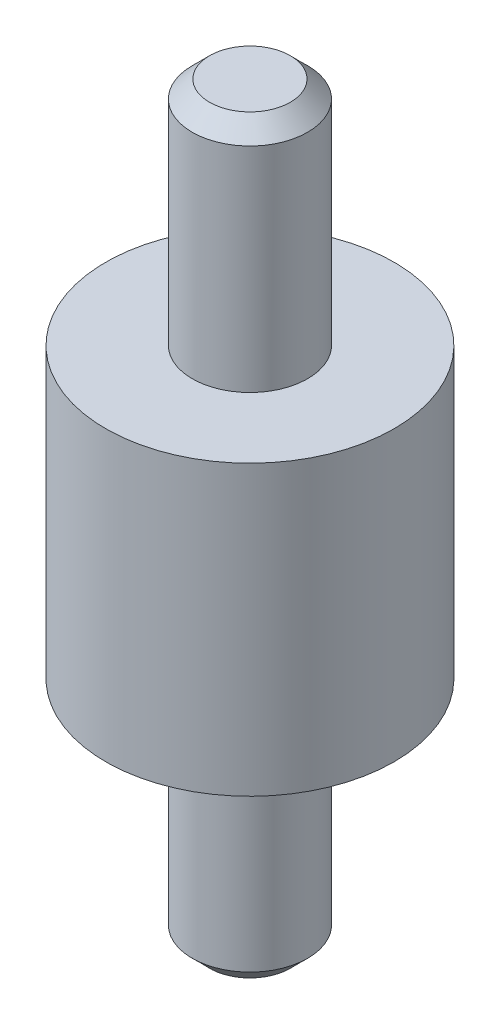
ISO-10303-21;
HEADER;
FILE_DESCRIPTION(('STEP AP214'),'2;1');
FILE_NAME('part.step','',(''),(''),'','','');
FILE_SCHEMA(('AUTOMOTIVE_DESIGN { 1 0 10303 214 1 1 1 1 }'));
ENDSEC;
DATA;
#1=APPLICATION_CONTEXT('core data for automotive mechanical design processes');
#2=APPLICATION_PROTOCOL_DEFINITION('international standard','automotive_design',2000,#1);
#3=PRODUCT_CONTEXT('',#1,'mechanical');
#4=PRODUCT('Part','Part','',(#3));
#5=PRODUCT_RELATED_PRODUCT_CATEGORY('part','',(#4));
#6=PRODUCT_DEFINITION_FORMATION('','',#4);
#7=PRODUCT_DEFINITION_CONTEXT('part definition',#1,'design');
#8=PRODUCT_DEFINITION('design','',#6,#7);
#9=PRODUCT_DEFINITION_SHAPE('','',#8);
#10=(LENGTH_UNIT() NAMED_UNIT(*) SI_UNIT(.MILLI.,.METRE.));
#11=(NAMED_UNIT(*) PLANE_ANGLE_UNIT() SI_UNIT($,.RADIAN.));
#12=(NAMED_UNIT(*) SI_UNIT($,.STERADIAN.) SOLID_ANGLE_UNIT());
#13=UNCERTAINTY_MEASURE_WITH_UNIT(LENGTH_MEASURE(1.E-05),#10,'distance_accuracy_value','');
#14=(GEOMETRIC_REPRESENTATION_CONTEXT(3) GLOBAL_UNCERTAINTY_ASSIGNED_CONTEXT((#13)) GLOBAL_UNIT_ASSIGNED_CONTEXT((#10,
#11,#12)) REPRESENTATION_CONTEXT('',''));
#15=CARTESIAN_POINT('',(0.,0.,0.));
#16=DIRECTION('',(0.,0.,1.));
#17=DIRECTION('',(1.,0.,0.));
#18=AXIS2_PLACEMENT_3D('',#15,#16,#17);
#19=CARTESIAN_POINT('',(0.,20.6375,0.));
#20=DIRECTION('',(0.,1.,0.));
#21=DIRECTION('',(0.,0.,1.));
#22=AXIS2_PLACEMENT_3D('',#19,#20,#21);
#23=PLANE('',#22);
#24=CARTESIAN_POINT('',(0.,20.6375,0.));
#25=DIRECTION('',(0.,1.,0.));
#26=DIRECTION('',(0.,0.,1.));
#27=AXIS2_PLACEMENT_3D('',#24,#25,#26);
#28=CIRCLE('',#27,2.2225);
#29=CARTESIAN_POINT('',(0.,20.6375,2.2225));
#30=VERTEX_POINT('',#29);
#31=EDGE_CURVE('E47',#30,#30,#28,.T.);
#32=ORIENTED_EDGE('',*,*,#31,.T.);
#33=EDGE_LOOP('',(#32));
#34=FACE_BOUND('',#33,.T.);
#35=ADVANCED_FACE('F39',(#34),#23,.T.);
#36=CARTESIAN_POINT('',(0.,7.9375,0.));
#37=DIRECTION('',(0.,-1.,0.));
#38=DIRECTION('',(0.,0.,-1.));
#39=AXIS2_PLACEMENT_3D('',#36,#37,#38);
#40=CYLINDRICAL_SURFACE('',#39,3.175);
#41=CARTESIAN_POINT('',(0.,19.685,0.));
#42=DIRECTION('',(0.,1.,0.));
#43=DIRECTION('',(0.,0.,1.));
#44=AXIS2_PLACEMENT_3D('',#41,#42,#43);
#45=CIRCLE('',#44,3.175);
#46=CARTESIAN_POINT('',(0.,19.685,3.175));
#47=VERTEX_POINT('',#46);
#48=EDGE_CURVE('E52',#47,#47,#45,.F.);
#49=ORIENTED_EDGE('',*,*,#48,.T.);
#50=EDGE_LOOP('',(#49));
#51=FACE_BOUND('',#50,.T.);
#52=CARTESIAN_POINT('',(0.,7.9375,0.));
#53=DIRECTION('',(0.,-1.,0.));
#54=DIRECTION('',(0.,0.,-1.));
#55=AXIS2_PLACEMENT_3D('',#52,#53,#54);
#56=CIRCLE('',#55,3.175);
#57=CARTESIAN_POINT('',(0.,7.9375,-3.175));
#58=VERTEX_POINT('',#57);
#59=EDGE_CURVE('E57',#58,#58,#56,.T.);
#60=ORIENTED_EDGE('',*,*,#59,.F.);
#61=EDGE_LOOP('',(#60));
#62=FACE_BOUND('',#61,.T.);
#63=ADVANCED_FACE('F95',(#51,#62),#40,.T.);
#64=CARTESIAN_POINT('',(0.,19.685,0.));
#65=DIRECTION('',(0.,-1.,0.));
#66=DIRECTION('',(0.,0.,-1.));
#67=AXIS2_PLACEMENT_3D('',#64,#65,#66);
#68=CONICAL_SURFACE('',#67,3.175,0.785398163397451);
#69=ORIENTED_EDGE('',*,*,#31,.F.);
#70=EDGE_LOOP('',(#69));
#71=FACE_BOUND('',#70,.T.);
#72=ORIENTED_EDGE('',*,*,#48,.F.);
#73=EDGE_LOOP('',(#72));
#74=FACE_BOUND('',#73,.T.);
#75=ADVANCED_FACE('F41',(#71,#74),#68,.T.);
#76=CARTESIAN_POINT('',(-7.9375,-7.9375,0.));
#77=DIRECTION('',(0.,-1.,0.));
#78=DIRECTION('',(1.,0.,0.));
#79=AXIS2_PLACEMENT_3D('',#76,#77,#78);
#80=PLANE('',#79);
#81=CARTESIAN_POINT('',(0.,-7.9375,0.));
#82=DIRECTION('',(0.,-1.,0.));
#83=DIRECTION('',(1.,0.,0.));
#84=AXIS2_PLACEMENT_3D('',#81,#82,#83);
#85=CIRCLE('',#84,3.175);
#86=CARTESIAN_POINT('',(3.175,-7.9375,0.));
#87=VERTEX_POINT('',#86);
#88=EDGE_CURVE('E10',#87,#87,#85,.T.);
#89=ORIENTED_EDGE('',*,*,#88,.F.);
#90=EDGE_LOOP('',(#89));
#91=FACE_BOUND('',#90,.T.);
#92=CARTESIAN_POINT('',(0.,-7.9375,0.));
#93=DIRECTION('',(0.,-1.,0.));
#94=DIRECTION('',(1.,0.,0.));
#95=AXIS2_PLACEMENT_3D('',#92,#93,#94);
#96=CIRCLE('',#95,7.9375);
#97=CARTESIAN_POINT('',(7.9375,-7.9375,0.));
#98=VERTEX_POINT('',#97);
#99=EDGE_CURVE('E67',#98,#98,#96,.T.);
#100=ORIENTED_EDGE('',*,*,#99,.T.);
#101=EDGE_LOOP('',(#100));
#102=FACE_BOUND('',#101,.T.);
#103=ADVANCED_FACE('F102',(#91,#102),#80,.T.);
#104=CARTESIAN_POINT('',(0.,7.9375,0.));
#105=DIRECTION('',(0.,1.,0.));
#106=DIRECTION('',(-1.,0.,0.));
#107=AXIS2_PLACEMENT_3D('',#104,#105,#106);
#108=PLANE('',#107);
#109=ORIENTED_EDGE('',*,*,#59,.T.);
#110=EDGE_LOOP('',(#109));
#111=FACE_BOUND('',#110,.T.);
#112=CARTESIAN_POINT('',(0.,7.9375,0.));
#113=DIRECTION('',(0.,-1.,0.));
#114=DIRECTION('',(1.,0.,0.));
#115=AXIS2_PLACEMENT_3D('',#112,#113,#114);
#116=CIRCLE('',#115,7.93750000000001);
#117=CARTESIAN_POINT('',(7.93750000000001,7.9375,0.));
#118=VERTEX_POINT('',#117);
#119=EDGE_CURVE('E63',#118,#118,#116,.T.);
#120=ORIENTED_EDGE('',*,*,#119,.F.);
#121=EDGE_LOOP('',(#120));
#122=FACE_BOUND('',#121,.T.);
#123=ADVANCED_FACE('F105',(#111,#122),#108,.T.);
#124=CARTESIAN_POINT('',(0.,-7.9375,0.));
#125=DIRECTION('',(0.,-1.,0.));
#126=DIRECTION('',(1.,0.,0.));
#127=AXIS2_PLACEMENT_3D('',#124,#125,#126);
#128=CYLINDRICAL_SURFACE('',#127,7.9375);
#129=ORIENTED_EDGE('',*,*,#119,.T.);
#130=EDGE_LOOP('',(#129));
#131=FACE_BOUND('',#130,.T.);
#132=ORIENTED_EDGE('',*,*,#99,.F.);
#133=EDGE_LOOP('',(#132));
#134=FACE_BOUND('',#133,.T.);
#135=ADVANCED_FACE('F108',(#131,#134),#128,.T.);
#136=CARTESIAN_POINT('',(0.,-20.6375,-1.4411089226075E-13));
#137=DIRECTION('',(0.,-1.,0.));
#138=DIRECTION('',(0.,0.,-1.));
#139=AXIS2_PLACEMENT_3D('',#136,#137,#138);
#140=PLANE('',#139);
#141=CARTESIAN_POINT('',(0.,-20.6375,-1.4411089226075E-13));
#142=DIRECTION('',(0.,-1.,0.));
#143=DIRECTION('',(0.,0.,-1.));
#144=AXIS2_PLACEMENT_3D('',#141,#142,#143);
#145=CIRCLE('',#144,2.2225);
#146=CARTESIAN_POINT('',(0.,-20.6375,-2.22250000000014));
#147=VERTEX_POINT('',#146);
#148=EDGE_CURVE('E71',#147,#147,#145,.T.);
#149=ORIENTED_EDGE('',*,*,#148,.T.);
#150=EDGE_LOOP('',(#149));
#151=FACE_BOUND('',#150,.T.);
#152=ADVANCED_FACE('F89',(#151),#140,.T.);
#153=CARTESIAN_POINT('',(0.,-7.9375,0.));
#154=DIRECTION('',(0.,1.,0.));
#155=DIRECTION('',(0.,0.,1.));
#156=AXIS2_PLACEMENT_3D('',#153,#154,#155);
#157=CYLINDRICAL_SURFACE('',#156,3.175);
#158=CARTESIAN_POINT('',(0.,-19.685,-1.37459620310254E-13));
#159=DIRECTION('',(0.,-1.,0.));
#160=DIRECTION('',(0.,0.,-1.));
#161=AXIS2_PLACEMENT_3D('',#158,#159,#160);
#162=CIRCLE('',#161,3.175);
#163=CARTESIAN_POINT('',(0.,-19.685,-3.17500000000014));
#164=VERTEX_POINT('',#163);
#165=EDGE_CURVE('E75',#164,#164,#162,.F.);
#166=ORIENTED_EDGE('',*,*,#165,.T.);
#167=EDGE_LOOP('',(#166));
#168=FACE_BOUND('',#167,.T.);
#169=ORIENTED_EDGE('',*,*,#88,.T.);
#170=EDGE_LOOP('',(#169));
#171=FACE_BOUND('',#170,.T.);
#172=ADVANCED_FACE('F80',(#168,#171),#157,.T.);
#173=CARTESIAN_POINT('',(0.,-19.685,-1.37459620310254E-13));
#174=DIRECTION('',(0.,1.,0.));
#175=DIRECTION('',(0.,0.,1.));
#176=AXIS2_PLACEMENT_3D('',#173,#174,#175);
#177=CONICAL_SURFACE('',#176,3.175,0.785398163397451);
#178=ORIENTED_EDGE('',*,*,#148,.F.);
#179=EDGE_LOOP('',(#178));
#180=FACE_BOUND('',#179,.T.);
#181=ORIENTED_EDGE('',*,*,#165,.F.);
#182=EDGE_LOOP('',(#181));
#183=FACE_BOUND('',#182,.T.);
#184=ADVANCED_FACE('F82',(#180,#183),#177,.T.);
#185=CLOSED_SHELL('',(#35,#63,#75,#103,#123,#135,#152,#172,#184));
#186=MANIFOLD_SOLID_BREP('B2',#185);
#187=ADVANCED_BREP_SHAPE_REPRESENTATION('',(#18,#186),#14);
#188=SHAPE_DEFINITION_REPRESENTATION(#9,#187);
ENDSEC;
END-ISO-10303-21;
